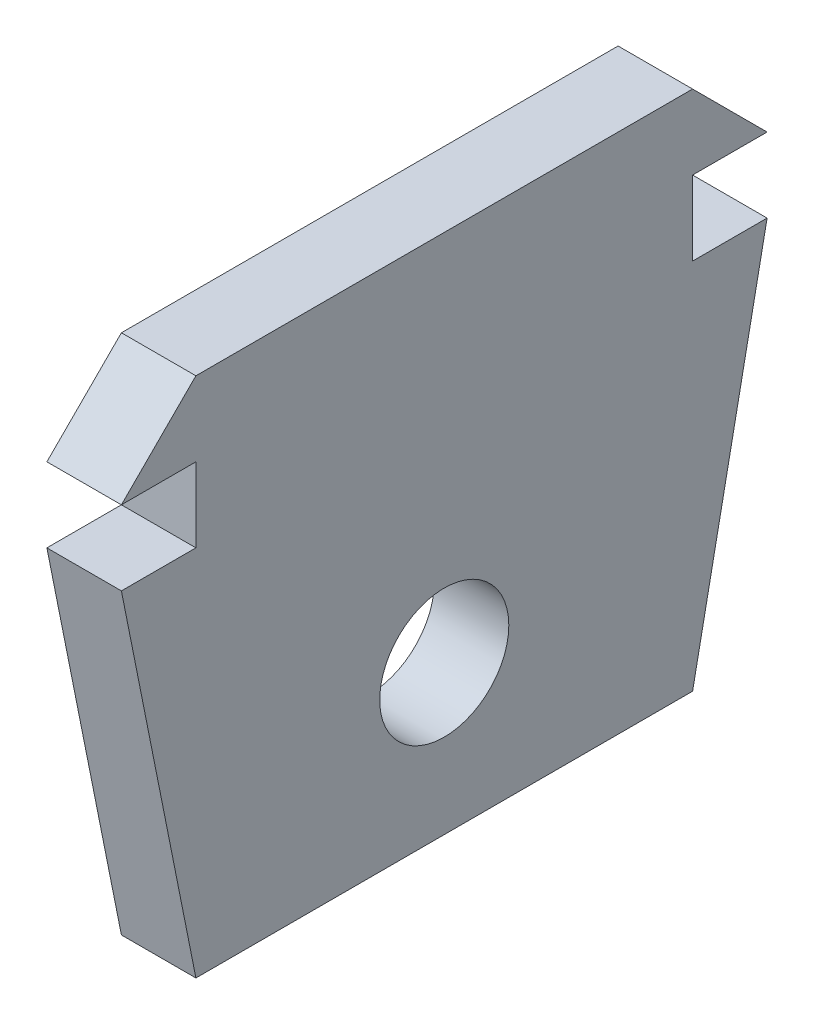
ISO-10303-21;
HEADER;
FILE_DESCRIPTION(('STEP AP214'),'2;1');
FILE_NAME('part.step','',(''),(''),'','','');
FILE_SCHEMA(('AUTOMOTIVE_DESIGN { 1 0 10303 214 1 1 1 1 }'));
ENDSEC;
DATA;
#1=APPLICATION_CONTEXT('core data for automotive mechanical design processes');
#2=APPLICATION_PROTOCOL_DEFINITION('international standard','automotive_design',2000,#1);
#3=PRODUCT_CONTEXT('',#1,'mechanical');
#4=PRODUCT('Part','Part','',(#3));
#5=PRODUCT_RELATED_PRODUCT_CATEGORY('part','',(#4));
#6=PRODUCT_DEFINITION_FORMATION('','',#4);
#7=PRODUCT_DEFINITION_CONTEXT('part definition',#1,'design');
#8=PRODUCT_DEFINITION('design','',#6,#7);
#9=PRODUCT_DEFINITION_SHAPE('','',#8);
#10=(LENGTH_UNIT() NAMED_UNIT(*) SI_UNIT(.MILLI.,.METRE.));
#11=(NAMED_UNIT(*) PLANE_ANGLE_UNIT() SI_UNIT($,.RADIAN.));
#12=(NAMED_UNIT(*) SI_UNIT($,.STERADIAN.) SOLID_ANGLE_UNIT());
#13=UNCERTAINTY_MEASURE_WITH_UNIT(LENGTH_MEASURE(1.E-05),#10,'distance_accuracy_value','');
#14=(GEOMETRIC_REPRESENTATION_CONTEXT(3) GLOBAL_UNCERTAINTY_ASSIGNED_CONTEXT((#13)) GLOBAL_UNIT_ASSIGNED_CONTEXT((#10,
#11,#12)) REPRESENTATION_CONTEXT('',''));
#15=CARTESIAN_POINT('',(0.,0.,0.));
#16=DIRECTION('',(0.,0.,1.));
#17=DIRECTION('',(1.,0.,0.));
#18=AXIS2_PLACEMENT_3D('',#15,#16,#17);
#19=CARTESIAN_POINT('',(3.,0.,20.));
#20=DIRECTION('',(1.,0.,0.));
#21=DIRECTION('',(0.,0.,-1.));
#22=AXIS2_PLACEMENT_3D('',#19,#20,#21);
#23=PLANE('',#22);
#24=DIRECTION('',(0.,-0.98058067569092,-0.196116135138184));
#25=VECTOR('',#24,1.);
#26=CARTESIAN_POINT('',(3.,15.,23.));
#27=LINE('',#26,#25);
#28=CARTESIAN_POINT('',(3.,15.,23.));
#29=VERTEX_POINT('',#28);
#30=CARTESIAN_POINT('',(3.,0.,20.));
#31=VERTEX_POINT('',#30);
#32=EDGE_CURVE('E180',#29,#31,#27,.T.);
#33=ORIENTED_EDGE('',*,*,#32,.T.);
#34=DIRECTION('',(0.,0.,-1.));
#35=VECTOR('',#34,1.);
#36=CARTESIAN_POINT('',(3.,0.,20.));
#37=LINE('',#36,#35);
#38=CARTESIAN_POINT('',(3.,0.,0.));
#39=VERTEX_POINT('',#38);
#40=EDGE_CURVE('E108',#31,#39,#37,.T.);
#41=ORIENTED_EDGE('',*,*,#40,.T.);
#42=DIRECTION('',(0.,0.98058067569092,-0.196116135138184));
#43=VECTOR('',#42,1.);
#44=CARTESIAN_POINT('',(3.,0.,0.));
#45=LINE('',#44,#43);
#46=CARTESIAN_POINT('',(3.,15.,-3.));
#47=VERTEX_POINT('',#46);
#48=EDGE_CURVE('E207',#39,#47,#45,.T.);
#49=ORIENTED_EDGE('',*,*,#48,.T.);
#50=DIRECTION('',(0.,0.,1.));
#51=VECTOR('',#50,1.);
#52=CARTESIAN_POINT('',(3.,15.,-3.));
#53=LINE('',#52,#51);
#54=CARTESIAN_POINT('',(3.,15.,0.));
#55=VERTEX_POINT('',#54);
#56=EDGE_CURVE('E226',#47,#55,#53,.T.);
#57=ORIENTED_EDGE('',*,*,#56,.T.);
#58=DIRECTION('',(0.,1.,0.));
#59=VECTOR('',#58,1.);
#60=CARTESIAN_POINT('',(3.,15.,0.));
#61=LINE('',#60,#59);
#62=CARTESIAN_POINT('',(3.,18.,0.));
#63=VERTEX_POINT('',#62);
#64=EDGE_CURVE('E223',#55,#63,#61,.T.);
#65=ORIENTED_EDGE('',*,*,#64,.T.);
#66=DIRECTION('',(0.,0.,-1.));
#67=VECTOR('',#66,1.);
#68=CARTESIAN_POINT('',(3.,18.,0.));
#69=LINE('',#68,#67);
#70=CARTESIAN_POINT('',(3.,18.,-3.));
#71=VERTEX_POINT('',#70);
#72=EDGE_CURVE('E225',#63,#71,#69,.T.);
#73=ORIENTED_EDGE('',*,*,#72,.T.);
#74=DIRECTION('',(0.,0.707106781186548,0.707106781186547));
#75=VECTOR('',#74,1.);
#76=CARTESIAN_POINT('',(3.,18.,-3.));
#77=LINE('',#76,#75);
#78=CARTESIAN_POINT('',(3.,21.,0.));
#79=VERTEX_POINT('',#78);
#80=EDGE_CURVE('E228',#71,#79,#77,.T.);
#81=ORIENTED_EDGE('',*,*,#80,.T.);
#82=DIRECTION('',(0.,0.,1.));
#83=VECTOR('',#82,1.);
#84=CARTESIAN_POINT('',(3.,21.,0.));
#85=LINE('',#84,#83);
#86=CARTESIAN_POINT('',(3.,21.,20.));
#87=VERTEX_POINT('',#86);
#88=EDGE_CURVE('E234',#79,#87,#85,.T.);
#89=ORIENTED_EDGE('',*,*,#88,.T.);
#90=DIRECTION('',(0.,-0.707106781186548,0.707106781186548));
#91=VECTOR('',#90,1.);
#92=CARTESIAN_POINT('',(3.,21.,20.));
#93=LINE('',#92,#91);
#94=CARTESIAN_POINT('',(3.,18.,23.));
#95=VERTEX_POINT('',#94);
#96=EDGE_CURVE('E139',#87,#95,#93,.T.);
#97=ORIENTED_EDGE('',*,*,#96,.T.);
#98=DIRECTION('',(0.,0.,-1.));
#99=VECTOR('',#98,1.);
#100=CARTESIAN_POINT('',(3.,18.,23.));
#101=LINE('',#100,#99);
#102=CARTESIAN_POINT('',(3.,18.,20.));
#103=VERTEX_POINT('',#102);
#104=EDGE_CURVE('E133',#95,#103,#101,.T.);
#105=ORIENTED_EDGE('',*,*,#104,.T.);
#106=DIRECTION('',(0.,-1.,0.));
#107=VECTOR('',#106,1.);
#108=CARTESIAN_POINT('',(3.,18.,20.));
#109=LINE('',#108,#107);
#110=CARTESIAN_POINT('',(3.,15.,20.));
#111=VERTEX_POINT('',#110);
#112=EDGE_CURVE('E137',#103,#111,#109,.T.);
#113=ORIENTED_EDGE('',*,*,#112,.T.);
#114=DIRECTION('',(0.,0.,1.));
#115=VECTOR('',#114,1.);
#116=CARTESIAN_POINT('',(3.,15.,20.));
#117=LINE('',#116,#115);
#118=EDGE_CURVE('E53',#111,#29,#117,.T.);
#119=ORIENTED_EDGE('',*,*,#118,.T.);
#120=EDGE_LOOP('',(#33,#41,#49,#57,#65,#73,#81,#89,#97,#105,#113,#119));
#121=FACE_BOUND('',#120,.T.);
#122=CARTESIAN_POINT('',(3.,6.,10.));
#123=DIRECTION('',(1.,0.,0.));
#124=DIRECTION('',(0.,0.,-1.));
#125=AXIS2_PLACEMENT_3D('',#122,#123,#124);
#126=CIRCLE('',#125,2.6);
#127=CARTESIAN_POINT('',(3.,6.,7.4));
#128=VERTEX_POINT('',#127);
#129=EDGE_CURVE('E161',#128,#128,#126,.T.);
#130=ORIENTED_EDGE('',*,*,#129,.F.);
#131=EDGE_LOOP('',(#130));
#132=FACE_BOUND('',#131,.T.);
#133=ADVANCED_FACE('F36',(#121,#132),#23,.T.);
#134=CARTESIAN_POINT('',(0.,0.,20.));
#135=DIRECTION('',(1.,0.,0.));
#136=DIRECTION('',(0.,0.,-1.));
#137=AXIS2_PLACEMENT_3D('',#134,#135,#136);
#138=PLANE('',#137);
#139=DIRECTION('',(0.,-0.98058067569092,-0.196116135138184));
#140=VECTOR('',#139,1.);
#141=CARTESIAN_POINT('',(0.,15.,23.));
#142=LINE('',#141,#140);
#143=CARTESIAN_POINT('',(0.,15.,23.));
#144=VERTEX_POINT('',#143);
#145=CARTESIAN_POINT('',(0.,0.,20.));
#146=VERTEX_POINT('',#145);
#147=EDGE_CURVE('E157',#144,#146,#142,.T.);
#148=ORIENTED_EDGE('',*,*,#147,.F.);
#149=DIRECTION('',(0.,0.,1.));
#150=VECTOR('',#149,1.);
#151=CARTESIAN_POINT('',(0.,15.,20.));
#152=LINE('',#151,#150);
#153=CARTESIAN_POINT('',(0.,15.,20.));
#154=VERTEX_POINT('',#153);
#155=EDGE_CURVE('E100',#154,#144,#152,.T.);
#156=ORIENTED_EDGE('',*,*,#155,.F.);
#157=DIRECTION('',(0.,-1.,0.));
#158=VECTOR('',#157,1.);
#159=CARTESIAN_POINT('',(0.,18.,20.));
#160=LINE('',#159,#158);
#161=CARTESIAN_POINT('',(0.,18.,20.));
#162=VERTEX_POINT('',#161);
#163=EDGE_CURVE('E94',#162,#154,#160,.T.);
#164=ORIENTED_EDGE('',*,*,#163,.F.);
#165=DIRECTION('',(0.,0.,-1.));
#166=VECTOR('',#165,1.);
#167=CARTESIAN_POINT('',(0.,18.,23.));
#168=LINE('',#167,#166);
#169=CARTESIAN_POINT('',(0.,18.,23.));
#170=VERTEX_POINT('',#169);
#171=EDGE_CURVE('E147',#170,#162,#168,.T.);
#172=ORIENTED_EDGE('',*,*,#171,.F.);
#173=DIRECTION('',(0.,-0.707106781186548,0.707106781186548));
#174=VECTOR('',#173,1.);
#175=CARTESIAN_POINT('',(0.,21.,20.));
#176=LINE('',#175,#174);
#177=CARTESIAN_POINT('',(0.,21.,20.));
#178=VERTEX_POINT('',#177);
#179=EDGE_CURVE('E175',#178,#170,#176,.T.);
#180=ORIENTED_EDGE('',*,*,#179,.F.);
#181=DIRECTION('',(0.,0.,1.));
#182=VECTOR('',#181,1.);
#183=CARTESIAN_POINT('',(0.,21.,0.));
#184=LINE('',#183,#182);
#185=CARTESIAN_POINT('',(0.,21.,0.));
#186=VERTEX_POINT('',#185);
#187=EDGE_CURVE('E173',#186,#178,#184,.T.);
#188=ORIENTED_EDGE('',*,*,#187,.F.);
#189=DIRECTION('',(0.,0.707106781186548,0.707106781186547));
#190=VECTOR('',#189,1.);
#191=CARTESIAN_POINT('',(0.,18.,-3.));
#192=LINE('',#191,#190);
#193=CARTESIAN_POINT('',(0.,18.,-3.));
#194=VERTEX_POINT('',#193);
#195=EDGE_CURVE('E171',#194,#186,#192,.T.);
#196=ORIENTED_EDGE('',*,*,#195,.F.);
#197=DIRECTION('',(0.,0.,-1.));
#198=VECTOR('',#197,1.);
#199=CARTESIAN_POINT('',(0.,18.,0.));
#200=LINE('',#199,#198);
#201=CARTESIAN_POINT('',(0.,18.,0.));
#202=VERTEX_POINT('',#201);
#203=EDGE_CURVE('E169',#202,#194,#200,.T.);
#204=ORIENTED_EDGE('',*,*,#203,.F.);
#205=DIRECTION('',(0.,1.,0.));
#206=VECTOR('',#205,1.);
#207=CARTESIAN_POINT('',(0.,15.,0.));
#208=LINE('',#207,#206);
#209=CARTESIAN_POINT('',(0.,15.,0.));
#210=VERTEX_POINT('',#209);
#211=EDGE_CURVE('E167',#210,#202,#208,.T.);
#212=ORIENTED_EDGE('',*,*,#211,.F.);
#213=DIRECTION('',(0.,0.,1.));
#214=VECTOR('',#213,1.);
#215=CARTESIAN_POINT('',(0.,15.,-3.));
#216=LINE('',#215,#214);
#217=CARTESIAN_POINT('',(0.,15.,-3.));
#218=VERTEX_POINT('',#217);
#219=EDGE_CURVE('E165',#218,#210,#216,.T.);
#220=ORIENTED_EDGE('',*,*,#219,.F.);
#221=DIRECTION('',(0.,0.98058067569092,-0.196116135138184));
#222=VECTOR('',#221,1.);
#223=CARTESIAN_POINT('',(0.,0.,0.));
#224=LINE('',#223,#222);
#225=CARTESIAN_POINT('',(0.,0.,0.));
#226=VERTEX_POINT('',#225);
#227=EDGE_CURVE('E163',#226,#218,#224,.T.);
#228=ORIENTED_EDGE('',*,*,#227,.F.);
#229=DIRECTION('',(0.,0.,-1.));
#230=VECTOR('',#229,1.);
#231=CARTESIAN_POINT('',(0.,0.,20.));
#232=LINE('',#231,#230);
#233=EDGE_CURVE('E160',#146,#226,#232,.T.);
#234=ORIENTED_EDGE('',*,*,#233,.F.);
#235=EDGE_LOOP('',(#148,#156,#164,#172,#180,#188,#196,#204,#212,#220,#228,#234));
#236=FACE_BOUND('',#235,.T.);
#237=CARTESIAN_POINT('',(0.,6.,10.));
#238=DIRECTION('',(1.,0.,0.));
#239=DIRECTION('',(0.,0.,-1.));
#240=AXIS2_PLACEMENT_3D('',#237,#238,#239);
#241=CIRCLE('',#240,2.6);
#242=CARTESIAN_POINT('',(0.,6.,7.4));
#243=VERTEX_POINT('',#242);
#244=EDGE_CURVE('E381',#243,#243,#241,.T.);
#245=ORIENTED_EDGE('',*,*,#244,.T.);
#246=EDGE_LOOP('',(#245));
#247=FACE_BOUND('',#246,.T.);
#248=ADVANCED_FACE('F211',(#236,#247),#138,.F.);
#249=CARTESIAN_POINT('',(3.,15.,23.));
#250=DIRECTION('',(0.,0.196116135138184,-0.98058067569092));
#251=DIRECTION('',(0.,0.98058067569092,0.196116135138184));
#252=AXIS2_PLACEMENT_3D('',#249,#250,#251);
#253=PLANE('',#252);
#254=ORIENTED_EDGE('',*,*,#147,.T.);
#255=DIRECTION('',(-1.,0.,0.));
#256=VECTOR('',#255,1.);
#257=CARTESIAN_POINT('',(3.,0.,20.));
#258=LINE('',#257,#256);
#259=EDGE_CURVE('E11',#31,#146,#258,.T.);
#260=ORIENTED_EDGE('',*,*,#259,.F.);
#261=ORIENTED_EDGE('',*,*,#32,.F.);
#262=DIRECTION('',(-1.,0.,0.));
#263=VECTOR('',#262,1.);
#264=CARTESIAN_POINT('',(3.,15.,23.));
#265=LINE('',#264,#263);
#266=EDGE_CURVE('E153',#29,#144,#265,.T.);
#267=ORIENTED_EDGE('',*,*,#266,.T.);
#268=EDGE_LOOP('',(#254,#260,#261,#267));
#269=FACE_BOUND('',#268,.T.);
#270=ADVANCED_FACE('F38',(#269),#253,.F.);
#271=CARTESIAN_POINT('',(3.,0.,20.));
#272=DIRECTION('',(0.,1.,0.));
#273=DIRECTION('',(0.,0.,1.));
#274=AXIS2_PLACEMENT_3D('',#271,#272,#273);
#275=PLANE('',#274);
#276=ORIENTED_EDGE('',*,*,#233,.T.);
#277=DIRECTION('',(-1.,0.,0.));
#278=VECTOR('',#277,1.);
#279=CARTESIAN_POINT('',(3.,0.,0.));
#280=LINE('',#279,#278);
#281=EDGE_CURVE('E45',#39,#226,#280,.T.);
#282=ORIENTED_EDGE('',*,*,#281,.F.);
#283=ORIENTED_EDGE('',*,*,#40,.F.);
#284=ORIENTED_EDGE('',*,*,#259,.T.);
#285=EDGE_LOOP('',(#276,#282,#283,#284));
#286=FACE_BOUND('',#285,.T.);
#287=ADVANCED_FACE('F268',(#286),#275,.F.);
#288=CARTESIAN_POINT('',(3.,0.,0.));
#289=DIRECTION('',(0.,0.196116135138184,0.98058067569092));
#290=DIRECTION('',(0.,-0.98058067569092,0.196116135138184));
#291=AXIS2_PLACEMENT_3D('',#288,#289,#290);
#292=PLANE('',#291);
#293=ORIENTED_EDGE('',*,*,#227,.T.);
#294=DIRECTION('',(-1.,0.,0.));
#295=VECTOR('',#294,1.);
#296=CARTESIAN_POINT('',(3.,15.,-3.));
#297=LINE('',#296,#295);
#298=EDGE_CURVE('E199',#47,#218,#297,.T.);
#299=ORIENTED_EDGE('',*,*,#298,.F.);
#300=ORIENTED_EDGE('',*,*,#48,.F.);
#301=ORIENTED_EDGE('',*,*,#281,.T.);
#302=EDGE_LOOP('',(#293,#299,#300,#301));
#303=FACE_BOUND('',#302,.T.);
#304=ADVANCED_FACE('F205',(#303),#292,.F.);
#305=CARTESIAN_POINT('',(3.,15.,-3.));
#306=DIRECTION('',(0.,-1.,0.));
#307=DIRECTION('',(0.,0.,-1.));
#308=AXIS2_PLACEMENT_3D('',#305,#306,#307);
#309=PLANE('',#308);
#310=ORIENTED_EDGE('',*,*,#219,.T.);
#311=DIRECTION('',(-1.,0.,0.));
#312=VECTOR('',#311,1.);
#313=CARTESIAN_POINT('',(3.,15.,0.));
#314=LINE('',#313,#312);
#315=EDGE_CURVE('E196',#55,#210,#314,.T.);
#316=ORIENTED_EDGE('',*,*,#315,.F.);
#317=ORIENTED_EDGE('',*,*,#56,.F.);
#318=ORIENTED_EDGE('',*,*,#298,.T.);
#319=EDGE_LOOP('',(#310,#316,#317,#318));
#320=FACE_BOUND('',#319,.T.);
#321=ADVANCED_FACE('F217',(#320),#309,.F.);
#322=CARTESIAN_POINT('',(3.,15.,0.));
#323=DIRECTION('',(0.,0.,1.));
#324=DIRECTION('',(1.,0.,0.));
#325=AXIS2_PLACEMENT_3D('',#322,#323,#324);
#326=PLANE('',#325);
#327=ORIENTED_EDGE('',*,*,#211,.T.);
#328=DIRECTION('',(-1.,0.,0.));
#329=VECTOR('',#328,1.);
#330=CARTESIAN_POINT('',(3.,18.,0.));
#331=LINE('',#330,#329);
#332=EDGE_CURVE('E193',#63,#202,#331,.T.);
#333=ORIENTED_EDGE('',*,*,#332,.F.);
#334=ORIENTED_EDGE('',*,*,#64,.F.);
#335=ORIENTED_EDGE('',*,*,#315,.T.);
#336=EDGE_LOOP('',(#327,#333,#334,#335));
#337=FACE_BOUND('',#336,.T.);
#338=ADVANCED_FACE('F221',(#337),#326,.F.);
#339=CARTESIAN_POINT('',(3.,18.,0.));
#340=DIRECTION('',(0.,1.,0.));
#341=DIRECTION('',(0.,0.,1.));
#342=AXIS2_PLACEMENT_3D('',#339,#340,#341);
#343=PLANE('',#342);
#344=ORIENTED_EDGE('',*,*,#203,.T.);
#345=DIRECTION('',(-1.,0.,0.));
#346=VECTOR('',#345,1.);
#347=CARTESIAN_POINT('',(3.,18.,-3.));
#348=LINE('',#347,#346);
#349=EDGE_CURVE('E190',#71,#194,#348,.T.);
#350=ORIENTED_EDGE('',*,*,#349,.F.);
#351=ORIENTED_EDGE('',*,*,#72,.F.);
#352=ORIENTED_EDGE('',*,*,#332,.T.);
#353=EDGE_LOOP('',(#344,#350,#351,#352));
#354=FACE_BOUND('',#353,.T.);
#355=ADVANCED_FACE('F281',(#354),#343,.F.);
#356=CARTESIAN_POINT('',(3.,18.,-3.));
#357=DIRECTION('',(0.,-0.707106781186547,0.707106781186548));
#358=DIRECTION('',(0.,-0.707106781186548,-0.707106781186547));
#359=AXIS2_PLACEMENT_3D('',#356,#357,#358);
#360=PLANE('',#359);
#361=ORIENTED_EDGE('',*,*,#195,.T.);
#362=DIRECTION('',(-1.,0.,0.));
#363=VECTOR('',#362,1.);
#364=CARTESIAN_POINT('',(3.,21.,0.));
#365=LINE('',#364,#363);
#366=EDGE_CURVE('E187',#79,#186,#365,.T.);
#367=ORIENTED_EDGE('',*,*,#366,.F.);
#368=ORIENTED_EDGE('',*,*,#80,.F.);
#369=ORIENTED_EDGE('',*,*,#349,.T.);
#370=EDGE_LOOP('',(#361,#367,#368,#369));
#371=FACE_BOUND('',#370,.T.);
#372=ADVANCED_FACE('F284',(#371),#360,.F.);
#373=CARTESIAN_POINT('',(3.,21.,0.));
#374=DIRECTION('',(0.,-1.,0.));
#375=DIRECTION('',(0.,0.,-1.));
#376=AXIS2_PLACEMENT_3D('',#373,#374,#375);
#377=PLANE('',#376);
#378=ORIENTED_EDGE('',*,*,#187,.T.);
#379=DIRECTION('',(-1.,0.,0.));
#380=VECTOR('',#379,1.);
#381=CARTESIAN_POINT('',(3.,21.,20.));
#382=LINE('',#381,#380);
#383=EDGE_CURVE('E184',#87,#178,#382,.T.);
#384=ORIENTED_EDGE('',*,*,#383,.F.);
#385=ORIENTED_EDGE('',*,*,#88,.F.);
#386=ORIENTED_EDGE('',*,*,#366,.T.);
#387=EDGE_LOOP('',(#378,#384,#385,#386));
#388=FACE_BOUND('',#387,.T.);
#389=ADVANCED_FACE('F240',(#388),#377,.F.);
#390=CARTESIAN_POINT('',(3.,21.,20.));
#391=DIRECTION('',(0.,-0.707106781186547,-0.707106781186547));
#392=DIRECTION('',(0.,0.707106781186548,-0.707106781186548));
#393=AXIS2_PLACEMENT_3D('',#390,#391,#392);
#394=PLANE('',#393);
#395=ORIENTED_EDGE('',*,*,#179,.T.);
#396=DIRECTION('',(-1.,0.,0.));
#397=VECTOR('',#396,1.);
#398=CARTESIAN_POINT('',(3.,18.,23.));
#399=LINE('',#398,#397);
#400=EDGE_CURVE('E148',#95,#170,#399,.T.);
#401=ORIENTED_EDGE('',*,*,#400,.F.);
#402=ORIENTED_EDGE('',*,*,#96,.F.);
#403=ORIENTED_EDGE('',*,*,#383,.T.);
#404=EDGE_LOOP('',(#395,#401,#402,#403));
#405=FACE_BOUND('',#404,.T.);
#406=ADVANCED_FACE('F244',(#405),#394,.F.);
#407=CARTESIAN_POINT('',(3.,18.,23.));
#408=DIRECTION('',(0.,1.,0.));
#409=DIRECTION('',(0.,0.,1.));
#410=AXIS2_PLACEMENT_3D('',#407,#408,#409);
#411=PLANE('',#410);
#412=ORIENTED_EDGE('',*,*,#171,.T.);
#413=DIRECTION('',(-1.,0.,0.));
#414=VECTOR('',#413,1.);
#415=CARTESIAN_POINT('',(3.,18.,20.));
#416=LINE('',#415,#414);
#417=EDGE_CURVE('E144',#103,#162,#416,.T.);
#418=ORIENTED_EDGE('',*,*,#417,.F.);
#419=ORIENTED_EDGE('',*,*,#104,.F.);
#420=ORIENTED_EDGE('',*,*,#400,.T.);
#421=EDGE_LOOP('',(#412,#418,#419,#420));
#422=FACE_BOUND('',#421,.T.);
#423=ADVANCED_FACE('F145',(#422),#411,.F.);
#424=CARTESIAN_POINT('',(3.,18.,20.));
#425=DIRECTION('',(0.,0.,-1.));
#426=DIRECTION('',(-1.,0.,0.));
#427=AXIS2_PLACEMENT_3D('',#424,#425,#426);
#428=PLANE('',#427);
#429=ORIENTED_EDGE('',*,*,#163,.T.);
#430=DIRECTION('',(-1.,0.,0.));
#431=VECTOR('',#430,1.);
#432=CARTESIAN_POINT('',(3.,15.,20.));
#433=LINE('',#432,#431);
#434=EDGE_CURVE('E149',#111,#154,#433,.T.);
#435=ORIENTED_EDGE('',*,*,#434,.F.);
#436=ORIENTED_EDGE('',*,*,#112,.F.);
#437=ORIENTED_EDGE('',*,*,#417,.T.);
#438=EDGE_LOOP('',(#429,#435,#436,#437));
#439=FACE_BOUND('',#438,.T.);
#440=ADVANCED_FACE('F151',(#439),#428,.F.);
#441=CARTESIAN_POINT('',(3.,15.,20.));
#442=DIRECTION('',(0.,-1.,0.));
#443=DIRECTION('',(0.,0.,-1.));
#444=AXIS2_PLACEMENT_3D('',#441,#442,#443);
#445=PLANE('',#444);
#446=ORIENTED_EDGE('',*,*,#155,.T.);
#447=ORIENTED_EDGE('',*,*,#266,.F.);
#448=ORIENTED_EDGE('',*,*,#118,.F.);
#449=ORIENTED_EDGE('',*,*,#434,.T.);
#450=EDGE_LOOP('',(#446,#447,#448,#449));
#451=FACE_BOUND('',#450,.T.);
#452=ADVANCED_FACE('F248',(#451),#445,.F.);
#453=CARTESIAN_POINT('',(3.,6.,10.));
#454=DIRECTION('',(-1.,0.,0.));
#455=DIRECTION('',(0.,0.,1.));
#456=AXIS2_PLACEMENT_3D('',#453,#454,#455);
#457=CYLINDRICAL_SURFACE('',#456,2.6);
#458=ORIENTED_EDGE('',*,*,#129,.T.);
#459=EDGE_LOOP('',(#458));
#460=FACE_BOUND('',#459,.T.);
#461=ORIENTED_EDGE('',*,*,#244,.F.);
#462=EDGE_LOOP('',(#461));
#463=FACE_BOUND('',#462,.T.);
#464=ADVANCED_FACE('F250',(#460,#463),#457,.F.);
#465=CLOSED_SHELL('',(#133,#248,#270,#287,#304,#321,#338,#355,#372,#389,#406,#423,#440,#452,#464));
#466=MANIFOLD_SOLID_BREP('B2',#465);
#467=ADVANCED_BREP_SHAPE_REPRESENTATION('',(#18,#466),#14);
#468=SHAPE_DEFINITION_REPRESENTATION(#9,#467);
ENDSEC;
END-ISO-10303-21;
